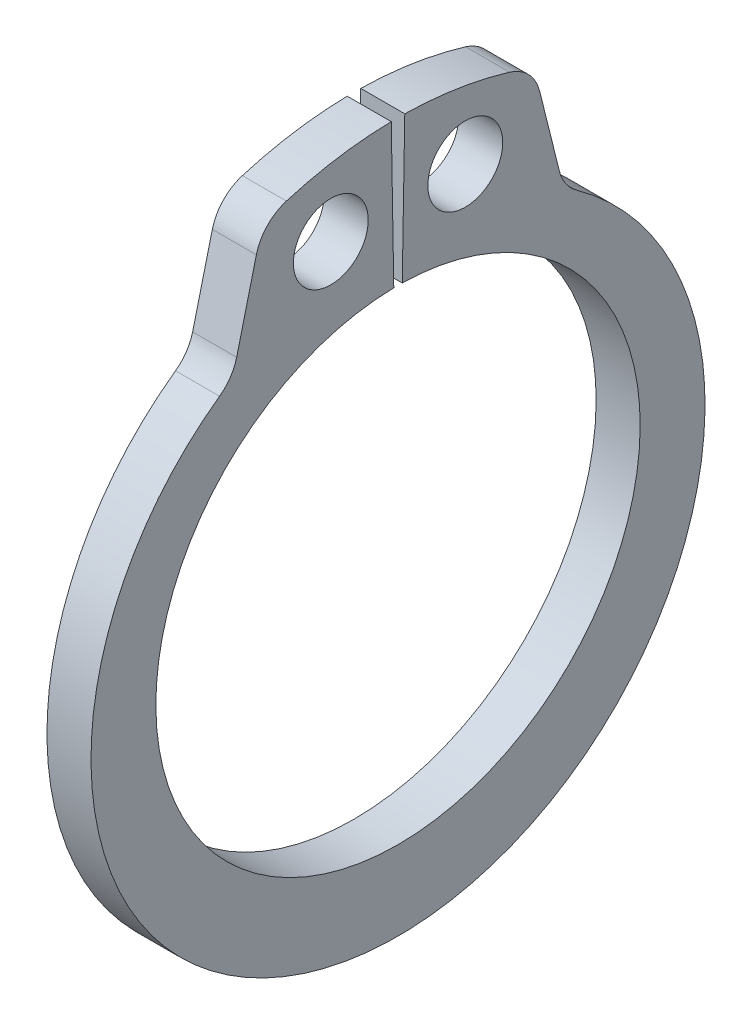
ISO-10303-21;
HEADER;
FILE_DESCRIPTION(('STEP AP214'),'2;1');
FILE_NAME('part.step','',(''),(''),'','','');
FILE_SCHEMA(('AUTOMOTIVE_DESIGN { 1 0 10303 214 1 1 1 1 }'));
ENDSEC;
DATA;
#1=APPLICATION_CONTEXT('core data for automotive mechanical design processes');
#2=APPLICATION_PROTOCOL_DEFINITION('international standard','automotive_design',2000,#1);
#3=PRODUCT_CONTEXT('',#1,'mechanical');
#4=PRODUCT('Part','Part','',(#3));
#5=PRODUCT_RELATED_PRODUCT_CATEGORY('part','',(#4));
#6=PRODUCT_DEFINITION_FORMATION('','',#4);
#7=PRODUCT_DEFINITION_CONTEXT('part definition',#1,'design');
#8=PRODUCT_DEFINITION('design','',#6,#7);
#9=PRODUCT_DEFINITION_SHAPE('','',#8);
#10=(LENGTH_UNIT() NAMED_UNIT(*) SI_UNIT(.MILLI.,.METRE.));
#11=(NAMED_UNIT(*) PLANE_ANGLE_UNIT() SI_UNIT($,.RADIAN.));
#12=(NAMED_UNIT(*) SI_UNIT($,.STERADIAN.) SOLID_ANGLE_UNIT());
#13=UNCERTAINTY_MEASURE_WITH_UNIT(LENGTH_MEASURE(1.E-05),#10,'distance_accuracy_value','');
#14=(GEOMETRIC_REPRESENTATION_CONTEXT(3) GLOBAL_UNCERTAINTY_ASSIGNED_CONTEXT((#13)) GLOBAL_UNIT_ASSIGNED_CONTEXT((#10,
#11,#12)) REPRESENTATION_CONTEXT('',''));
#15=CARTESIAN_POINT('',(0.,0.,0.));
#16=DIRECTION('',(0.,0.,1.));
#17=DIRECTION('',(1.,0.,0.));
#18=AXIS2_PLACEMENT_3D('',#15,#16,#17);
#19=CARTESIAN_POINT('',(0.5,0.,0.));
#20=DIRECTION('',(1.,0.,0.));
#21=DIRECTION('',(0.,0.,-1.));
#22=AXIS2_PLACEMENT_3D('',#19,#20,#21);
#23=PLANE('',#22);
#24=CARTESIAN_POINT('',(0.5,7.12443231524778,1.52716878314637));
#25=DIRECTION('',(1.,0.,0.));
#26=DIRECTION('',(0.,0.,-1.));
#27=AXIS2_PLACEMENT_3D('',#24,#25,#26);
#28=CIRCLE('',#27,0.85);
#29=CARTESIAN_POINT('',(0.5,7.12443231524778,0.677168783146365));
#30=VERTEX_POINT('',#29);
#31=EDGE_CURVE('E218',#30,#30,#28,.T.);
#32=ORIENTED_EDGE('',*,*,#31,.F.);
#33=EDGE_LOOP('',(#32));
#34=FACE_BOUND('',#33,.T.);
#35=CARTESIAN_POINT('',(0.5,0.,0.));
#36=DIRECTION('',(1.,0.,0.));
#37=DIRECTION('',(0.,0.,-1.));
#38=AXIS2_PLACEMENT_3D('',#35,#36,#37);
#39=CIRCLE('',#38,8.80000000000002);
#40=CARTESIAN_POINT('',(0.5,8.79865971737624,0.153581176648095));
#41=VERTEX_POINT('',#40);
#42=CARTESIAN_POINT('',(0.5,8.42695620843539,2.53503630370697));
#43=VERTEX_POINT('',#42);
#44=EDGE_CURVE('E135',#41,#43,#39,.T.);
#45=ORIENTED_EDGE('',*,*,#44,.T.);
#46=CARTESIAN_POINT('',(0.5,7.46934754838591,2.24696399646754));
#47=DIRECTION('',(1.,0.,0.));
#48=DIRECTION('',(0.,0.,-1.));
#49=AXIS2_PLACEMENT_3D('',#46,#47,#48);
#50=CIRCLE('',#49,1.);
#51=CARTESIAN_POINT('',(0.5,7.71126944398557,3.21725972274354));
#52=VERTEX_POINT('',#51);
#53=EDGE_CURVE('E172',#43,#52,#50,.T.);
#54=ORIENTED_EDGE('',*,*,#53,.T.);
#55=DIRECTION('',(0.,-0.970295726275997,0.241921895599665));
#56=VECTOR('',#55,1.);
#57=CARTESIAN_POINT('',(0.5,8.24150618523941,3.08505685501264));
#58=LINE('',#57,#56);
#59=CARTESIAN_POINT('',(0.5,5.91904505898335,3.66411144930298));
#60=VERTEX_POINT('',#59);
#61=EDGE_CURVE('E210',#52,#60,#58,.T.);
#62=ORIENTED_EDGE('',*,*,#61,.T.);
#63=CARTESIAN_POINT('',(0.5,6.16096695458301,4.63440717557898));
#64=DIRECTION('',(1.,0.,0.));
#65=DIRECTION('',(0.,0.,-1.));
#66=AXIS2_PLACEMENT_3D('',#63,#64,#65);
#67=CIRCLE('',#66,1.);
#68=CARTESIAN_POINT('',(0.5,5.34724606819442,4.05315136351775));
#69=VERTEX_POINT('',#68);
#70=EDGE_CURVE('E183',#60,#69,#67,.F.);
#71=ORIENTED_EDGE('',*,*,#70,.T.);
#72=CARTESIAN_POINT('',(0.5,-0.32690608951574,0.));
#73=DIRECTION('',(1.,0.,0.));
#74=DIRECTION('',(0.,0.,-1.));
#75=AXIS2_PLACEMENT_3D('',#72,#73,#74);
#76=CIRCLE('',#75,6.97309391048426);
#77=CARTESIAN_POINT('',(0.5,5.34724606819442,-4.05315136351775));
#78=VERTEX_POINT('',#77);
#79=EDGE_CURVE('E205',#69,#78,#76,.T.);
#80=ORIENTED_EDGE('',*,*,#79,.T.);
#81=CARTESIAN_POINT('',(0.5,6.16096695458301,-4.63440717557898));
#82=DIRECTION('',(1.,0.,0.));
#83=DIRECTION('',(0.,0.,-1.));
#84=AXIS2_PLACEMENT_3D('',#81,#82,#83);
#85=CIRCLE('',#84,1.);
#86=CARTESIAN_POINT('',(0.5,5.91904505898335,-3.66411144930299));
#87=VERTEX_POINT('',#86);
#88=EDGE_CURVE('E11',#78,#87,#85,.F.);
#89=ORIENTED_EDGE('',*,*,#88,.T.);
#90=DIRECTION('',(0.,0.970295726275997,0.241921895599666));
#91=VECTOR('',#90,1.);
#92=CARTESIAN_POINT('',(0.5,8.24150618523941,-3.08505685501264));
#93=LINE('',#92,#91);
#94=CARTESIAN_POINT('',(0.5,7.71126944398557,-3.21725972274354));
#95=VERTEX_POINT('',#94);
#96=EDGE_CURVE('E204',#87,#95,#93,.T.);
#97=ORIENTED_EDGE('',*,*,#96,.T.);
#98=CARTESIAN_POINT('',(0.5,7.46934754838591,-2.24696399646754));
#99=DIRECTION('',(1.,0.,0.));
#100=DIRECTION('',(0.,0.,-1.));
#101=AXIS2_PLACEMENT_3D('',#98,#99,#100);
#102=CIRCLE('',#101,1.);
#103=CARTESIAN_POINT('',(0.5,8.42695620843539,-2.53503630370697));
#104=VERTEX_POINT('',#103);
#105=EDGE_CURVE('E50',#95,#104,#102,.T.);
#106=ORIENTED_EDGE('',*,*,#105,.T.);
#107=CARTESIAN_POINT('',(0.5,0.,0.));
#108=DIRECTION('',(1.,0.,0.));
#109=DIRECTION('',(0.,0.,1.));
#110=AXIS2_PLACEMENT_3D('',#107,#108,#109);
#111=CIRCLE('',#110,8.8);
#112=CARTESIAN_POINT('',(0.5,8.79865971737624,-0.153581176648097));
#113=VERTEX_POINT('',#112);
#114=EDGE_CURVE('E207',#104,#113,#111,.T.);
#115=ORIENTED_EDGE('',*,*,#114,.T.);
#116=DIRECTION('',(0.,-0.999847695156391,0.0174524064372837));
#117=VECTOR('',#116,1.);
#118=CARTESIAN_POINT('',(0.5,8.79865971737624,-0.153581176648096));
#119=LINE('',#118,#117);
#120=CARTESIAN_POINT('',(0.5,5.49916232336015,-0.0959882354050595));
#121=VERTEX_POINT('',#120);
#122=EDGE_CURVE('E141',#113,#121,#119,.T.);
#123=ORIENTED_EDGE('',*,*,#122,.T.);
#124=CARTESIAN_POINT('',(0.5,0.,0.));
#125=DIRECTION('',(-1.,0.,0.));
#126=DIRECTION('',(0.,0.,-1.));
#127=AXIS2_PLACEMENT_3D('',#124,#125,#126);
#128=CIRCLE('',#127,5.5);
#129=CARTESIAN_POINT('',(0.5,5.49916232336015,0.0959882354050595));
#130=VERTEX_POINT('',#129);
#131=EDGE_CURVE('E136',#121,#130,#128,.T.);
#132=ORIENTED_EDGE('',*,*,#131,.T.);
#133=DIRECTION('',(0.,0.999847695156391,0.0174524064372835));
#134=VECTOR('',#133,1.);
#135=CARTESIAN_POINT('',(0.5,5.49916232336015,0.0959882354050595));
#136=LINE('',#135,#134);
#137=EDGE_CURVE('E125',#130,#41,#136,.T.);
#138=ORIENTED_EDGE('',*,*,#137,.T.);
#139=EDGE_LOOP('',(#45,#54,#62,#71,#80,#89,#97,#106,#115,#123,#132,#138));
#140=FACE_BOUND('',#139,.T.);
#141=CARTESIAN_POINT('',(0.5,7.12443231524778,-1.52716878314637));
#142=DIRECTION('',(1.,0.,0.));
#143=DIRECTION('',(0.,0.,-1.));
#144=AXIS2_PLACEMENT_3D('',#141,#142,#143);
#145=CIRCLE('',#144,0.85);
#146=CARTESIAN_POINT('',(0.5,7.12443231524778,-2.37716878314637));
#147=VERTEX_POINT('',#146);
#148=EDGE_CURVE('E247',#147,#147,#145,.T.);
#149=ORIENTED_EDGE('',*,*,#148,.F.);
#150=EDGE_LOOP('',(#149));
#151=FACE_BOUND('',#150,.T.);
#152=ADVANCED_FACE('F35',(#34,#140,#151),#23,.T.);
#153=CARTESIAN_POINT('',(-0.5,0.,0.));
#154=DIRECTION('',(1.,0.,0.));
#155=DIRECTION('',(0.,0.,-1.));
#156=AXIS2_PLACEMENT_3D('',#153,#154,#155);
#157=PLANE('',#156);
#158=CARTESIAN_POINT('',(-0.5,7.12443231524778,1.52716878314637));
#159=DIRECTION('',(1.,0.,0.));
#160=DIRECTION('',(0.,0.,-1.));
#161=AXIS2_PLACEMENT_3D('',#158,#159,#160);
#162=CIRCLE('',#161,0.85);
#163=CARTESIAN_POINT('',(-0.5,7.12443231524778,0.677168783146365));
#164=VERTEX_POINT('',#163);
#165=EDGE_CURVE('E244',#164,#164,#162,.T.);
#166=ORIENTED_EDGE('',*,*,#165,.T.);
#167=EDGE_LOOP('',(#166));
#168=FACE_BOUND('',#167,.T.);
#169=DIRECTION('',(0.,-0.970295726275997,0.241921895599665));
#170=VECTOR('',#169,1.);
#171=CARTESIAN_POINT('',(-0.5,8.24150618523941,3.08505685501264));
#172=LINE('',#171,#170);
#173=CARTESIAN_POINT('',(-0.5,7.71126944398557,3.21725972274354));
#174=VERTEX_POINT('',#173);
#175=CARTESIAN_POINT('',(-0.5,5.91904505898335,3.66411144930298));
#176=VERTEX_POINT('',#175);
#177=EDGE_CURVE('E201',#174,#176,#172,.T.);
#178=ORIENTED_EDGE('',*,*,#177,.F.);
#179=CARTESIAN_POINT('',(-0.5,7.46934754838591,2.24696399646754));
#180=DIRECTION('',(1.,0.,0.));
#181=DIRECTION('',(0.,0.,-1.));
#182=AXIS2_PLACEMENT_3D('',#179,#180,#181);
#183=CIRCLE('',#182,1.);
#184=CARTESIAN_POINT('',(-0.5,8.42695620843539,2.53503630370697));
#185=VERTEX_POINT('',#184);
#186=EDGE_CURVE('E167',#174,#185,#183,.F.);
#187=ORIENTED_EDGE('',*,*,#186,.T.);
#188=CARTESIAN_POINT('',(-0.5,0.,0.));
#189=DIRECTION('',(1.,0.,0.));
#190=DIRECTION('',(0.,0.,-1.));
#191=AXIS2_PLACEMENT_3D('',#188,#189,#190);
#192=CIRCLE('',#191,8.80000000000002);
#193=CARTESIAN_POINT('',(-0.5,8.79865971737624,0.153581176648095));
#194=VERTEX_POINT('',#193);
#195=EDGE_CURVE('E220',#194,#185,#192,.T.);
#196=ORIENTED_EDGE('',*,*,#195,.F.);
#197=DIRECTION('',(0.,0.999847695156391,0.0174524064372835));
#198=VECTOR('',#197,1.);
#199=CARTESIAN_POINT('',(-0.5,5.49916232336015,0.0959882354050595));
#200=LINE('',#199,#198);
#201=CARTESIAN_POINT('',(-0.5,5.49916232336015,0.0959882354050595));
#202=VERTEX_POINT('',#201);
#203=EDGE_CURVE('E217',#202,#194,#200,.T.);
#204=ORIENTED_EDGE('',*,*,#203,.F.);
#205=CARTESIAN_POINT('',(-0.5,0.,0.));
#206=DIRECTION('',(-1.,0.,0.));
#207=DIRECTION('',(0.,0.,-1.));
#208=AXIS2_PLACEMENT_3D('',#205,#206,#207);
#209=CIRCLE('',#208,5.5);
#210=CARTESIAN_POINT('',(-0.5,5.49916232336015,-0.0959882354050595));
#211=VERTEX_POINT('',#210);
#212=EDGE_CURVE('E149',#211,#202,#209,.T.);
#213=ORIENTED_EDGE('',*,*,#212,.F.);
#214=DIRECTION('',(0.,-0.999847695156391,0.0174524064372837));
#215=VECTOR('',#214,1.);
#216=CARTESIAN_POINT('',(-0.5,8.79865971737624,-0.153581176648096));
#217=LINE('',#216,#215);
#218=CARTESIAN_POINT('',(-0.5,8.79865971737624,-0.153581176648097));
#219=VERTEX_POINT('',#218);
#220=EDGE_CURVE('E145',#219,#211,#217,.T.);
#221=ORIENTED_EDGE('',*,*,#220,.F.);
#222=CARTESIAN_POINT('',(-0.5,0.,0.));
#223=DIRECTION('',(1.,0.,0.));
#224=DIRECTION('',(0.,0.,1.));
#225=AXIS2_PLACEMENT_3D('',#222,#223,#224);
#226=CIRCLE('',#225,8.8);
#227=CARTESIAN_POINT('',(-0.5,8.42695620843539,-2.53503630370697));
#228=VERTEX_POINT('',#227);
#229=EDGE_CURVE('E226',#228,#219,#226,.T.);
#230=ORIENTED_EDGE('',*,*,#229,.F.);
#231=CARTESIAN_POINT('',(-0.5,7.46934754838591,-2.24696399646754));
#232=DIRECTION('',(1.,0.,0.));
#233=DIRECTION('',(0.,0.,-1.));
#234=AXIS2_PLACEMENT_3D('',#231,#232,#233);
#235=CIRCLE('',#234,1.);
#236=CARTESIAN_POINT('',(-0.5,7.71126944398557,-3.21725972274354));
#237=VERTEX_POINT('',#236);
#238=EDGE_CURVE('E165',#228,#237,#235,.F.);
#239=ORIENTED_EDGE('',*,*,#238,.T.);
#240=DIRECTION('',(0.,0.970295726275997,0.241921895599666));
#241=VECTOR('',#240,1.);
#242=CARTESIAN_POINT('',(-0.5,8.24150618523941,-3.08505685501264));
#243=LINE('',#242,#241);
#244=CARTESIAN_POINT('',(-0.5,5.91904505898335,-3.66411144930299));
#245=VERTEX_POINT('',#244);
#246=EDGE_CURVE('E192',#245,#237,#243,.T.);
#247=ORIENTED_EDGE('',*,*,#246,.F.);
#248=CARTESIAN_POINT('',(-0.5,6.16096695458301,-4.63440717557898));
#249=DIRECTION('',(1.,0.,0.));
#250=DIRECTION('',(0.,0.,-1.));
#251=AXIS2_PLACEMENT_3D('',#248,#249,#250);
#252=CIRCLE('',#251,1.);
#253=CARTESIAN_POINT('',(-0.5,5.34724606819442,-4.05315136351775));
#254=VERTEX_POINT('',#253);
#255=EDGE_CURVE('E43',#245,#254,#252,.T.);
#256=ORIENTED_EDGE('',*,*,#255,.T.);
#257=CARTESIAN_POINT('',(-0.5,-0.32690608951574,0.));
#258=DIRECTION('',(1.,0.,0.));
#259=DIRECTION('',(0.,0.,-1.));
#260=AXIS2_PLACEMENT_3D('',#257,#258,#259);
#261=CIRCLE('',#260,6.97309391048426);
#262=CARTESIAN_POINT('',(-0.5,5.34724606819442,4.05315136351775));
#263=VERTEX_POINT('',#262);
#264=EDGE_CURVE('E191',#263,#254,#261,.T.);
#265=ORIENTED_EDGE('',*,*,#264,.F.);
#266=CARTESIAN_POINT('',(-0.5,6.16096695458301,4.63440717557898));
#267=DIRECTION('',(1.,0.,0.));
#268=DIRECTION('',(0.,0.,-1.));
#269=AXIS2_PLACEMENT_3D('',#266,#267,#268);
#270=CIRCLE('',#269,1.);
#271=EDGE_CURVE('E181',#263,#176,#270,.T.);
#272=ORIENTED_EDGE('',*,*,#271,.T.);
#273=EDGE_LOOP('',(#178,#187,#196,#204,#213,#221,#230,#239,#247,#256,#265,#272));
#274=FACE_BOUND('',#273,.T.);
#275=CARTESIAN_POINT('',(-0.5,7.12443231524778,-1.52716878314637));
#276=DIRECTION('',(1.,0.,0.));
#277=DIRECTION('',(0.,0.,-1.));
#278=AXIS2_PLACEMENT_3D('',#275,#276,#277);
#279=CIRCLE('',#278,0.85);
#280=CARTESIAN_POINT('',(-0.5,7.12443231524778,-2.37716878314637));
#281=VERTEX_POINT('',#280);
#282=EDGE_CURVE('E250',#281,#281,#279,.T.);
#283=ORIENTED_EDGE('',*,*,#282,.T.);
#284=EDGE_LOOP('',(#283));
#285=FACE_BOUND('',#284,.T.);
#286=ADVANCED_FACE('F189',(#168,#274,#285),#157,.F.);
#287=CARTESIAN_POINT('',(0.5,0.,0.));
#288=DIRECTION('',(-1.,0.,0.));
#289=DIRECTION('',(0.,0.,1.));
#290=AXIS2_PLACEMENT_3D('',#287,#288,#289);
#291=CYLINDRICAL_SURFACE('',#290,5.5);
#292=ORIENTED_EDGE('',*,*,#212,.T.);
#293=DIRECTION('',(-1.,0.,0.));
#294=VECTOR('',#293,1.);
#295=CARTESIAN_POINT('',(0.5,5.49916232336015,0.0959882354050595));
#296=LINE('',#295,#294);
#297=EDGE_CURVE('E129',#130,#202,#296,.T.);
#298=ORIENTED_EDGE('',*,*,#297,.F.);
#299=ORIENTED_EDGE('',*,*,#131,.F.);
#300=DIRECTION('',(-1.,0.,0.));
#301=VECTOR('',#300,1.);
#302=CARTESIAN_POINT('',(0.5,5.49916232336015,-0.0959882354050595));
#303=LINE('',#302,#301);
#304=EDGE_CURVE('E215',#121,#211,#303,.T.);
#305=ORIENTED_EDGE('',*,*,#304,.T.);
#306=EDGE_LOOP('',(#292,#298,#299,#305));
#307=FACE_BOUND('',#306,.T.);
#308=ADVANCED_FACE('F147',(#307),#291,.F.);
#309=CARTESIAN_POINT('',(0.5,5.49916232336015,0.0959882354050595));
#310=DIRECTION('',(0.,-0.0174524064372835,0.999847695156391));
#311=DIRECTION('',(0.,-0.999847695156391,-0.0174524064372835));
#312=AXIS2_PLACEMENT_3D('',#309,#310,#311);
#313=PLANE('',#312);
#314=ORIENTED_EDGE('',*,*,#203,.T.);
#315=DIRECTION('',(-1.,0.,0.));
#316=VECTOR('',#315,1.);
#317=CARTESIAN_POINT('',(0.5,8.79865971737624,0.153581176648095));
#318=LINE('',#317,#316);
#319=EDGE_CURVE('E132',#41,#194,#318,.T.);
#320=ORIENTED_EDGE('',*,*,#319,.F.);
#321=ORIENTED_EDGE('',*,*,#137,.F.);
#322=ORIENTED_EDGE('',*,*,#297,.T.);
#323=EDGE_LOOP('',(#314,#320,#321,#322));
#324=FACE_BOUND('',#323,.T.);
#325=ADVANCED_FACE('F127',(#324),#313,.F.);
#326=CARTESIAN_POINT('',(0.5,0.,0.));
#327=DIRECTION('',(-1.,0.,0.));
#328=DIRECTION('',(0.,0.,1.));
#329=AXIS2_PLACEMENT_3D('',#326,#327,#328);
#330=CYLINDRICAL_SURFACE('',#329,8.80000000000002);
#331=ORIENTED_EDGE('',*,*,#195,.T.);
#332=DIRECTION('',(-1.,0.,0.));
#333=VECTOR('',#332,1.);
#334=CARTESIAN_POINT('',(0.5,8.42695620843539,2.53503630370697));
#335=LINE('',#334,#333);
#336=EDGE_CURVE('E169',#185,#43,#335,.F.);
#337=ORIENTED_EDGE('',*,*,#336,.T.);
#338=ORIENTED_EDGE('',*,*,#44,.F.);
#339=ORIENTED_EDGE('',*,*,#319,.T.);
#340=EDGE_LOOP('',(#331,#337,#338,#339));
#341=FACE_BOUND('',#340,.T.);
#342=ADVANCED_FACE('F238',(#341),#330,.T.);
#343=CARTESIAN_POINT('',(0.5,8.24150618523941,3.08505685501264));
#344=DIRECTION('',(0.,-0.241921895599665,-0.970295726275997));
#345=DIRECTION('',(0.,0.970295726275997,-0.241921895599665));
#346=AXIS2_PLACEMENT_3D('',#343,#344,#345);
#347=PLANE('',#346);
#348=ORIENTED_EDGE('',*,*,#177,.T.);
#349=DIRECTION('',(1.,0.,0.));
#350=VECTOR('',#349,1.);
#351=CARTESIAN_POINT('',(0.5,5.91904505898335,3.66411144930298));
#352=LINE('',#351,#350);
#353=EDGE_CURVE('E163',#176,#60,#352,.T.);
#354=ORIENTED_EDGE('',*,*,#353,.T.);
#355=ORIENTED_EDGE('',*,*,#61,.F.);
#356=DIRECTION('',(-1.,0.,0.));
#357=VECTOR('',#356,1.);
#358=CARTESIAN_POINT('',(0.5,7.71126944398557,3.21725972274354));
#359=LINE('',#358,#357);
#360=EDGE_CURVE('E160',#52,#174,#359,.T.);
#361=ORIENTED_EDGE('',*,*,#360,.T.);
#362=EDGE_LOOP('',(#348,#354,#355,#361));
#363=FACE_BOUND('',#362,.T.);
#364=ADVANCED_FACE('F280',(#363),#347,.F.);
#365=CARTESIAN_POINT('',(0.5,-0.32690608951574,0.));
#366=DIRECTION('',(-1.,0.,0.));
#367=DIRECTION('',(0.,0.,1.));
#368=AXIS2_PLACEMENT_3D('',#365,#366,#367);
#369=CYLINDRICAL_SURFACE('',#368,6.97309391048426);
#370=ORIENTED_EDGE('',*,*,#79,.F.);
#371=DIRECTION('',(-1.,0.,0.));
#372=VECTOR('',#371,1.);
#373=CARTESIAN_POINT('',(0.5,5.34724606819442,4.05315136351775));
#374=LINE('',#373,#372);
#375=EDGE_CURVE('E152',#69,#263,#374,.T.);
#376=ORIENTED_EDGE('',*,*,#375,.T.);
#377=ORIENTED_EDGE('',*,*,#264,.T.);
#378=DIRECTION('',(-1.,0.,0.));
#379=VECTOR('',#378,1.);
#380=CARTESIAN_POINT('',(0.5,5.34724606819442,-4.05315136351775));
#381=LINE('',#380,#379);
#382=EDGE_CURVE('E150',#254,#78,#381,.F.);
#383=ORIENTED_EDGE('',*,*,#382,.T.);
#384=EDGE_LOOP('',(#370,#376,#377,#383));
#385=FACE_BOUND('',#384,.T.);
#386=ADVANCED_FACE('F198',(#385),#369,.T.);
#387=CARTESIAN_POINT('',(0.5,8.24150618523941,-3.08505685501264));
#388=DIRECTION('',(0.,-0.241921895599666,0.970295726275997));
#389=DIRECTION('',(0.,-0.970295726275997,-0.241921895599666));
#390=AXIS2_PLACEMENT_3D('',#387,#388,#389);
#391=PLANE('',#390);
#392=ORIENTED_EDGE('',*,*,#246,.T.);
#393=DIRECTION('',(-1.,0.,0.));
#394=VECTOR('',#393,1.);
#395=CARTESIAN_POINT('',(0.5,7.71126944398557,-3.21725972274354));
#396=LINE('',#395,#394);
#397=EDGE_CURVE('E58',#237,#95,#396,.F.);
#398=ORIENTED_EDGE('',*,*,#397,.T.);
#399=ORIENTED_EDGE('',*,*,#96,.F.);
#400=DIRECTION('',(1.,0.,0.));
#401=VECTOR('',#400,1.);
#402=CARTESIAN_POINT('',(-0.5,5.91904505898334,-3.66411144930299));
#403=LINE('',#402,#401);
#404=EDGE_CURVE('E177',#87,#245,#403,.F.);
#405=ORIENTED_EDGE('',*,*,#404,.T.);
#406=EDGE_LOOP('',(#392,#398,#399,#405));
#407=FACE_BOUND('',#406,.T.);
#408=ADVANCED_FACE('F206',(#407),#391,.F.);
#409=CARTESIAN_POINT('',(0.5,0.,0.));
#410=DIRECTION('',(-1.,0.,0.));
#411=DIRECTION('',(0.,0.,1.));
#412=AXIS2_PLACEMENT_3D('',#409,#410,#411);
#413=CYLINDRICAL_SURFACE('',#412,8.8);
#414=ORIENTED_EDGE('',*,*,#114,.F.);
#415=DIRECTION('',(-1.,0.,0.));
#416=VECTOR('',#415,1.);
#417=CARTESIAN_POINT('',(0.5,8.42695620843539,-2.53503630370697));
#418=LINE('',#417,#416);
#419=EDGE_CURVE('E174',#104,#228,#418,.T.);
#420=ORIENTED_EDGE('',*,*,#419,.T.);
#421=ORIENTED_EDGE('',*,*,#229,.T.);
#422=DIRECTION('',(-1.,0.,0.));
#423=VECTOR('',#422,1.);
#424=CARTESIAN_POINT('',(0.5,8.79865971737624,-0.153581176648097));
#425=LINE('',#424,#423);
#426=EDGE_CURVE('E154',#113,#219,#425,.T.);
#427=ORIENTED_EDGE('',*,*,#426,.F.);
#428=EDGE_LOOP('',(#414,#420,#421,#427));
#429=FACE_BOUND('',#428,.T.);
#430=ADVANCED_FACE('F273',(#429),#413,.T.);
#431=CARTESIAN_POINT('',(0.5,8.79865971737624,-0.153581176648096));
#432=DIRECTION('',(0.,-0.0174524064372837,-0.999847695156391));
#433=DIRECTION('',(0.,0.999847695156391,-0.0174524064372837));
#434=AXIS2_PLACEMENT_3D('',#431,#432,#433);
#435=PLANE('',#434);
#436=ORIENTED_EDGE('',*,*,#220,.T.);
#437=ORIENTED_EDGE('',*,*,#304,.F.);
#438=ORIENTED_EDGE('',*,*,#122,.F.);
#439=ORIENTED_EDGE('',*,*,#426,.T.);
#440=EDGE_LOOP('',(#436,#437,#438,#439));
#441=FACE_BOUND('',#440,.T.);
#442=ADVANCED_FACE('F233',(#441),#435,.F.);
#443=CARTESIAN_POINT('',(0.5,7.12443231524778,1.52716878314637));
#444=DIRECTION('',(-1.,0.,0.));
#445=DIRECTION('',(0.,0.,1.));
#446=AXIS2_PLACEMENT_3D('',#443,#444,#445);
#447=CYLINDRICAL_SURFACE('',#446,0.85);
#448=ORIENTED_EDGE('',*,*,#31,.T.);
#449=EDGE_LOOP('',(#448));
#450=FACE_BOUND('',#449,.T.);
#451=ORIENTED_EDGE('',*,*,#165,.F.);
#452=EDGE_LOOP('',(#451));
#453=FACE_BOUND('',#452,.T.);
#454=ADVANCED_FACE('F268',(#450,#453),#447,.F.);
#455=CARTESIAN_POINT('',(0.5,7.12443231524778,-1.52716878314637));
#456=DIRECTION('',(-1.,0.,0.));
#457=DIRECTION('',(0.,0.,1.));
#458=AXIS2_PLACEMENT_3D('',#455,#456,#457);
#459=CYLINDRICAL_SURFACE('',#458,0.85);
#460=ORIENTED_EDGE('',*,*,#148,.T.);
#461=EDGE_LOOP('',(#460));
#462=FACE_BOUND('',#461,.T.);
#463=ORIENTED_EDGE('',*,*,#282,.F.);
#464=EDGE_LOOP('',(#463));
#465=FACE_BOUND('',#464,.T.);
#466=ADVANCED_FACE('F256',(#462,#465),#459,.F.);
#467=CARTESIAN_POINT('',(0.5,6.16096695458301,4.63440717557898));
#468=DIRECTION('',(-1.,0.,0.));
#469=DIRECTION('',(0.,0.,1.));
#470=AXIS2_PLACEMENT_3D('',#467,#468,#469);
#471=CYLINDRICAL_SURFACE('',#470,1.);
#472=ORIENTED_EDGE('',*,*,#70,.F.);
#473=ORIENTED_EDGE('',*,*,#353,.F.);
#474=ORIENTED_EDGE('',*,*,#271,.F.);
#475=ORIENTED_EDGE('',*,*,#375,.F.);
#476=EDGE_LOOP('',(#472,#473,#474,#475));
#477=FACE_BOUND('',#476,.T.);
#478=ADVANCED_FACE('F290',(#477),#471,.F.);
#479=CARTESIAN_POINT('',(0.5,7.46934754838591,2.24696399646754));
#480=DIRECTION('',(-1.,0.,0.));
#481=DIRECTION('',(0.,0.,1.));
#482=AXIS2_PLACEMENT_3D('',#479,#480,#481);
#483=CYLINDRICAL_SURFACE('',#482,1.);
#484=ORIENTED_EDGE('',*,*,#53,.F.);
#485=ORIENTED_EDGE('',*,*,#336,.F.);
#486=ORIENTED_EDGE('',*,*,#186,.F.);
#487=ORIENTED_EDGE('',*,*,#360,.F.);
#488=EDGE_LOOP('',(#484,#485,#486,#487));
#489=FACE_BOUND('',#488,.T.);
#490=ADVANCED_FACE('F293',(#489),#483,.T.);
#491=CARTESIAN_POINT('',(0.5,7.46934754838591,-2.24696399646754));
#492=DIRECTION('',(-1.,0.,0.));
#493=DIRECTION('',(0.,0.,1.));
#494=AXIS2_PLACEMENT_3D('',#491,#492,#493);
#495=CYLINDRICAL_SURFACE('',#494,1.);
#496=ORIENTED_EDGE('',*,*,#105,.F.);
#497=ORIENTED_EDGE('',*,*,#397,.F.);
#498=ORIENTED_EDGE('',*,*,#238,.F.);
#499=ORIENTED_EDGE('',*,*,#419,.F.);
#500=EDGE_LOOP('',(#496,#497,#498,#499));
#501=FACE_BOUND('',#500,.T.);
#502=ADVANCED_FACE('F296',(#501),#495,.T.);
#503=CARTESIAN_POINT('',(0.5,6.16096695458301,-4.63440717557898));
#504=DIRECTION('',(-1.,0.,0.));
#505=DIRECTION('',(0.,0.,1.));
#506=AXIS2_PLACEMENT_3D('',#503,#504,#505);
#507=CYLINDRICAL_SURFACE('',#506,1.);
#508=ORIENTED_EDGE('',*,*,#88,.F.);
#509=ORIENTED_EDGE('',*,*,#382,.F.);
#510=ORIENTED_EDGE('',*,*,#255,.F.);
#511=ORIENTED_EDGE('',*,*,#404,.F.);
#512=EDGE_LOOP('',(#508,#509,#510,#511));
#513=FACE_BOUND('',#512,.T.);
#514=ADVANCED_FACE('F37',(#513),#507,.F.);
#515=CLOSED_SHELL('',(#152,#286,#308,#325,#342,#364,#386,#408,#430,#442,#454,#466,#478,#490,
#502,#514));
#516=MANIFOLD_SOLID_BREP('B2',#515);
#517=ADVANCED_BREP_SHAPE_REPRESENTATION('',(#18,#516),#14);
#518=SHAPE_DEFINITION_REPRESENTATION(#9,#517);
ENDSEC;
END-ISO-10303-21;
